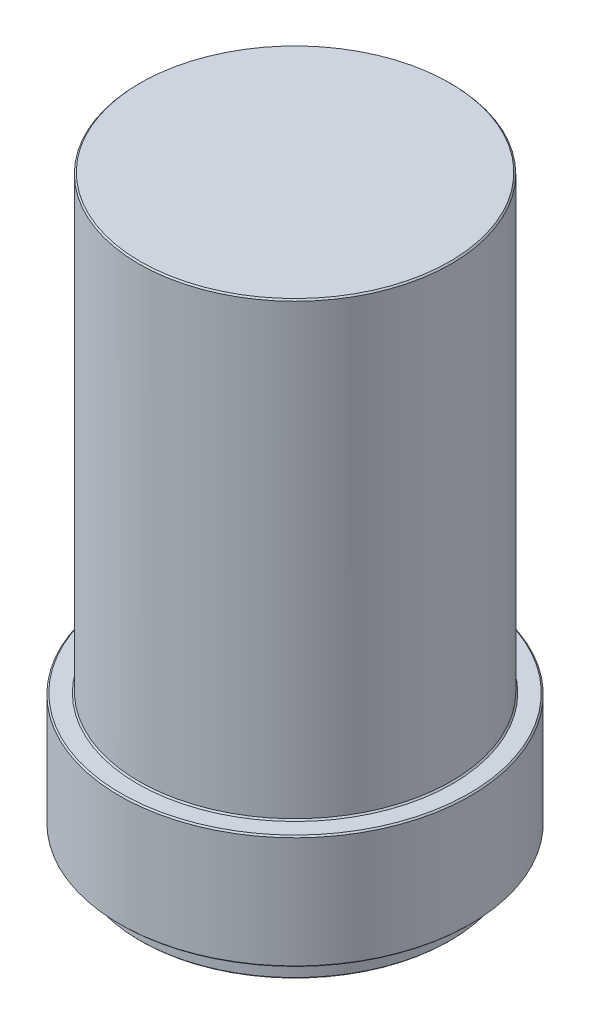
ISO-10303-21;
HEADER;
FILE_DESCRIPTION(('STEP AP214'),'2;1');
FILE_NAME('part.step','',(''),(''),'','','');
FILE_SCHEMA(('AUTOMOTIVE_DESIGN { 1 0 10303 214 1 1 1 1 }'));
ENDSEC;
DATA;
#1=APPLICATION_CONTEXT('core data for automotive mechanical design processes');
#2=APPLICATION_PROTOCOL_DEFINITION('international standard','automotive_design',2000,#1);
#3=PRODUCT_CONTEXT('',#1,'mechanical');
#4=PRODUCT('Part','Part','',(#3));
#5=PRODUCT_RELATED_PRODUCT_CATEGORY('part','',(#4));
#6=PRODUCT_DEFINITION_FORMATION('','',#4);
#7=PRODUCT_DEFINITION_CONTEXT('part definition',#1,'design');
#8=PRODUCT_DEFINITION('design','',#6,#7);
#9=PRODUCT_DEFINITION_SHAPE('','',#8);
#10=(LENGTH_UNIT() NAMED_UNIT(*) SI_UNIT(.MILLI.,.METRE.));
#11=(NAMED_UNIT(*) PLANE_ANGLE_UNIT() SI_UNIT($,.RADIAN.));
#12=(NAMED_UNIT(*) SI_UNIT($,.STERADIAN.) SOLID_ANGLE_UNIT());
#13=UNCERTAINTY_MEASURE_WITH_UNIT(LENGTH_MEASURE(1.E-05),#10,'distance_accuracy_value','');
#14=(GEOMETRIC_REPRESENTATION_CONTEXT(3) GLOBAL_UNCERTAINTY_ASSIGNED_CONTEXT((#13)) GLOBAL_UNIT_ASSIGNED_CONTEXT((#10,
#11,#12)) REPRESENTATION_CONTEXT('',''));
#15=CARTESIAN_POINT('',(0.,0.,0.));
#16=DIRECTION('',(0.,0.,1.));
#17=DIRECTION('',(1.,0.,0.));
#18=AXIS2_PLACEMENT_3D('',#15,#16,#17);
#19=CARTESIAN_POINT('',(0.,65.,0.));
#20=DIRECTION('',(0.,-1.,0.));
#21=DIRECTION('',(0.,0.,-1.));
#22=AXIS2_PLACEMENT_3D('',#19,#20,#21);
#23=CYLINDRICAL_SURFACE('',#22,22.5);
#24=CARTESIAN_POINT('',(0.,0.20000000000002,0.));
#25=DIRECTION('',(0.,-1.,0.));
#26=DIRECTION('',(0.,0.,-1.));
#27=AXIS2_PLACEMENT_3D('',#24,#25,#26);
#28=CIRCLE('',#27,22.5);
#29=CARTESIAN_POINT('',(0.,0.20000000000002,-22.5));
#30=VERTEX_POINT('',#29);
#31=EDGE_CURVE('E42',#30,#30,#28,.F.);
#32=ORIENTED_EDGE('',*,*,#31,.T.);
#33=EDGE_LOOP('',(#32));
#34=FACE_BOUND('',#33,.T.);
#35=CARTESIAN_POINT('',(0.,64.8,0.));
#36=DIRECTION('',(0.,1.,0.));
#37=DIRECTION('',(0.,0.,1.));
#38=AXIS2_PLACEMENT_3D('',#35,#36,#37);
#39=CIRCLE('',#38,22.5);
#40=CARTESIAN_POINT('',(0.,64.8,22.5));
#41=VERTEX_POINT('',#40);
#42=EDGE_CURVE('E46',#41,#41,#39,.F.);
#43=ORIENTED_EDGE('',*,*,#42,.T.);
#44=EDGE_LOOP('',(#43));
#45=FACE_BOUND('',#44,.T.);
#46=ADVANCED_FACE('F35',(#34,#45),#23,.T.);
#47=CARTESIAN_POINT('',(0.,65.,0.));
#48=DIRECTION('',(0.,1.,0.));
#49=DIRECTION('',(0.,0.,1.));
#50=AXIS2_PLACEMENT_3D('',#47,#48,#49);
#51=PLANE('',#50);
#52=CARTESIAN_POINT('',(0.,65.,0.));
#53=DIRECTION('',(0.,1.,0.));
#54=DIRECTION('',(0.,0.,1.));
#55=AXIS2_PLACEMENT_3D('',#52,#53,#54);
#56=CIRCLE('',#55,22.3);
#57=CARTESIAN_POINT('',(0.,65.,22.3));
#58=VERTEX_POINT('',#57);
#59=EDGE_CURVE('E10',#58,#58,#56,.T.);
#60=ORIENTED_EDGE('',*,*,#59,.T.);
#61=EDGE_LOOP('',(#60));
#62=FACE_BOUND('',#61,.T.);
#63=ADVANCED_FACE('F112',(#62),#51,.T.);
#64=CARTESIAN_POINT('',(0.,-16.4,0.));
#65=DIRECTION('',(0.,1.,0.));
#66=DIRECTION('',(0.,0.,1.));
#67=AXIS2_PLACEMENT_3D('',#64,#65,#66);
#68=CYLINDRICAL_SURFACE('',#67,25.3);
#69=CARTESIAN_POINT('',(0.,-16.2,0.));
#70=DIRECTION('',(0.,-1.,0.));
#71=DIRECTION('',(0.,0.,-1.));
#72=AXIS2_PLACEMENT_3D('',#69,#70,#71);
#73=CIRCLE('',#72,25.3);
#74=CARTESIAN_POINT('',(0.,-16.2,-25.3));
#75=VERTEX_POINT('',#74);
#76=EDGE_CURVE('E67',#75,#75,#73,.F.);
#77=ORIENTED_EDGE('',*,*,#76,.T.);
#78=EDGE_LOOP('',(#77));
#79=FACE_BOUND('',#78,.T.);
#80=CARTESIAN_POINT('',(0.,-0.200000000000027,0.));
#81=DIRECTION('',(0.,-1.,0.));
#82=DIRECTION('',(0.,0.,-1.));
#83=AXIS2_PLACEMENT_3D('',#80,#81,#82);
#84=CIRCLE('',#83,25.3);
#85=CARTESIAN_POINT('',(0.,-0.200000000000027,-25.3));
#86=VERTEX_POINT('',#85);
#87=EDGE_CURVE('E70',#86,#86,#84,.T.);
#88=ORIENTED_EDGE('',*,*,#87,.T.);
#89=EDGE_LOOP('',(#88));
#90=FACE_BOUND('',#89,.T.);
#91=ADVANCED_FACE('F117',(#79,#90),#68,.T.);
#92=CARTESIAN_POINT('',(0.,-16.4,0.));
#93=DIRECTION('',(0.,-1.,0.));
#94=DIRECTION('',(0.,0.,-1.));
#95=AXIS2_PLACEMENT_3D('',#92,#93,#94);
#96=PLANE('',#95);
#97=CARTESIAN_POINT('',(0.,-16.4,0.));
#98=DIRECTION('',(0.,-1.,0.));
#99=DIRECTION('',(0.,0.,-1.));
#100=AXIS2_PLACEMENT_3D('',#97,#98,#99);
#101=CIRCLE('',#100,25.1);
#102=CARTESIAN_POINT('',(0.,-16.4,-25.1));
#103=VERTEX_POINT('',#102);
#104=EDGE_CURVE('E73',#103,#103,#101,.T.);
#105=ORIENTED_EDGE('',*,*,#104,.T.);
#106=EDGE_LOOP('',(#105));
#107=FACE_BOUND('',#106,.T.);
#108=CARTESIAN_POINT('',(0.,-16.4,0.));
#109=DIRECTION('',(0.,-1.,0.));
#110=DIRECTION('',(0.,0.,-1.));
#111=AXIS2_PLACEMENT_3D('',#108,#109,#110);
#112=CIRCLE('',#111,22.6);
#113=CARTESIAN_POINT('',(0.,-16.4,22.6));
#114=VERTEX_POINT('',#113);
#115=EDGE_CURVE('E76',#114,#114,#112,.F.);
#116=ORIENTED_EDGE('',*,*,#115,.T.);
#117=EDGE_LOOP('',(#116));
#118=FACE_BOUND('',#117,.T.);
#119=ADVANCED_FACE('F80',(#107,#118),#96,.T.);
#120=CARTESIAN_POINT('',(0.,0.,0.));
#121=DIRECTION('',(0.,-1.,0.));
#122=DIRECTION('',(0.,0.,-1.));
#123=AXIS2_PLACEMENT_3D('',#120,#121,#122);
#124=PLANE('',#123);
#125=CARTESIAN_POINT('',(0.,0.,0.));
#126=DIRECTION('',(0.,-1.,0.));
#127=DIRECTION('',(0.,0.,-1.));
#128=AXIS2_PLACEMENT_3D('',#125,#126,#127);
#129=CIRCLE('',#128,25.1);
#130=CARTESIAN_POINT('',(0.,0.,-25.1));
#131=VERTEX_POINT('',#130);
#132=EDGE_CURVE('E50',#131,#131,#129,.F.);
#133=ORIENTED_EDGE('',*,*,#132,.T.);
#134=EDGE_LOOP('',(#133));
#135=FACE_BOUND('',#134,.T.);
#136=CARTESIAN_POINT('',(0.,0.,0.));
#137=DIRECTION('',(0.,-1.,0.));
#138=DIRECTION('',(0.,0.,-1.));
#139=AXIS2_PLACEMENT_3D('',#136,#137,#138);
#140=CIRCLE('',#139,22.7);
#141=CARTESIAN_POINT('',(0.,0.,-22.7));
#142=VERTEX_POINT('',#141);
#143=EDGE_CURVE('E55',#142,#142,#140,.T.);
#144=ORIENTED_EDGE('',*,*,#143,.T.);
#145=EDGE_LOOP('',(#144));
#146=FACE_BOUND('',#145,.T.);
#147=ADVANCED_FACE('F94',(#135,#146),#124,.F.);
#148=CARTESIAN_POINT('',(0.,-19.9,0.));
#149=DIRECTION('',(0.,1.,0.));
#150=DIRECTION('',(0.,0.,1.));
#151=AXIS2_PLACEMENT_3D('',#148,#149,#150);
#152=CYLINDRICAL_SURFACE('',#151,22.4);
#153=CARTESIAN_POINT('',(0.,-16.6,0.));
#154=DIRECTION('',(0.,-1.,0.));
#155=DIRECTION('',(0.,0.,-1.));
#156=AXIS2_PLACEMENT_3D('',#153,#154,#155);
#157=CIRCLE('',#156,22.4);
#158=CARTESIAN_POINT('',(0.,-16.6,22.4));
#159=VERTEX_POINT('',#158);
#160=EDGE_CURVE('E61',#159,#159,#157,.T.);
#161=ORIENTED_EDGE('',*,*,#160,.T.);
#162=EDGE_LOOP('',(#161));
#163=FACE_BOUND('',#162,.T.);
#164=CARTESIAN_POINT('',(0.,-19.7,0.));
#165=DIRECTION('',(0.,-1.,0.));
#166=DIRECTION('',(0.,0.,-1.));
#167=AXIS2_PLACEMENT_3D('',#164,#165,#166);
#168=CIRCLE('',#167,22.4);
#169=CARTESIAN_POINT('',(0.,-19.7,-22.4));
#170=VERTEX_POINT('',#169);
#171=EDGE_CURVE('E64',#170,#170,#168,.F.);
#172=ORIENTED_EDGE('',*,*,#171,.T.);
#173=EDGE_LOOP('',(#172));
#174=FACE_BOUND('',#173,.T.);
#175=ADVANCED_FACE('F90',(#163,#174),#152,.T.);
#176=CARTESIAN_POINT('',(0.,-19.9,0.));
#177=DIRECTION('',(0.,-1.,0.));
#178=DIRECTION('',(0.,0.,-1.));
#179=AXIS2_PLACEMENT_3D('',#176,#177,#178);
#180=PLANE('',#179);
#181=CARTESIAN_POINT('',(0.,-19.9,0.));
#182=DIRECTION('',(0.,-1.,0.));
#183=DIRECTION('',(0.,0.,-1.));
#184=AXIS2_PLACEMENT_3D('',#181,#182,#183);
#185=CIRCLE('',#184,22.2);
#186=CARTESIAN_POINT('',(0.,-19.9,-22.2));
#187=VERTEX_POINT('',#186);
#188=EDGE_CURVE('E58',#187,#187,#185,.T.);
#189=ORIENTED_EDGE('',*,*,#188,.T.);
#190=EDGE_LOOP('',(#189));
#191=FACE_BOUND('',#190,.T.);
#192=ADVANCED_FACE('F93',(#191),#180,.T.);
#193=CARTESIAN_POINT('',(0.,-16.4,0.));
#194=DIRECTION('',(0.,1.,0.));
#195=DIRECTION('',(0.,0.,1.));
#196=AXIS2_PLACEMENT_3D('',#193,#194,#195);
#197=CONICAL_SURFACE('',#196,25.1,0.785398163397422);
#198=ORIENTED_EDGE('',*,*,#76,.F.);
#199=EDGE_LOOP('',(#198));
#200=FACE_BOUND('',#199,.T.);
#201=ORIENTED_EDGE('',*,*,#104,.F.);
#202=EDGE_LOOP('',(#201));
#203=FACE_BOUND('',#202,.T.);
#204=ADVANCED_FACE('F86',(#200,#203),#197,.T.);
#205=CARTESIAN_POINT('',(0.,-16.6,0.));
#206=DIRECTION('',(0.,1.,0.));
#207=DIRECTION('',(0.,0.,1.));
#208=AXIS2_PLACEMENT_3D('',#205,#206,#207);
#209=CONICAL_SURFACE('',#208,22.4,0.785398163397466);
#210=CARTESIAN_POINT('',(0.,-16.4,22.6));
#211=CARTESIAN_POINT('',(0.,-16.4020833333333,22.5979166666667));
#212=CARTESIAN_POINT('',(0.,-16.4041666666667,22.5958333333333));
#213=CARTESIAN_POINT('',(0.,-16.4083333333333,22.5916666666667));
#214=CARTESIAN_POINT('',(0.,-16.4104166666667,22.5895833333333));
#215=CARTESIAN_POINT('',(0.,-16.4145833333333,22.5854166666667));
#216=CARTESIAN_POINT('',(0.,-16.4166666666667,22.5833333333333));
#217=CARTESIAN_POINT('',(0.,-16.4208333333333,22.5791666666667));
#218=CARTESIAN_POINT('',(0.,-16.4229166666667,22.5770833333333));
#219=CARTESIAN_POINT('',(0.,-16.4270833333333,22.5729166666667));
#220=CARTESIAN_POINT('',(0.,-16.4291666666667,22.5708333333333));
#221=CARTESIAN_POINT('',(0.,-16.4333333333333,22.5666666666667));
#222=CARTESIAN_POINT('',(0.,-16.4354166666667,22.5645833333333));
#223=CARTESIAN_POINT('',(0.,-16.4395833333333,22.5604166666667));
#224=CARTESIAN_POINT('',(0.,-16.4416666666667,22.5583333333333));
#225=CARTESIAN_POINT('',(0.,-16.4458333333333,22.5541666666667));
#226=CARTESIAN_POINT('',(0.,-16.4479166666667,22.5520833333333));
#227=CARTESIAN_POINT('',(0.,-16.4520833333333,22.5479166666667));
#228=CARTESIAN_POINT('',(0.,-16.4541666666667,22.5458333333333));
#229=CARTESIAN_POINT('',(0.,-16.4583333333333,22.5416666666667));
#230=CARTESIAN_POINT('',(0.,-16.4604166666667,22.5395833333333));
#231=CARTESIAN_POINT('',(0.,-16.4645833333333,22.5354166666667));
#232=CARTESIAN_POINT('',(0.,-16.4666666666667,22.5333333333333));
#233=CARTESIAN_POINT('',(0.,-16.4708333333333,22.5291666666667));
#234=CARTESIAN_POINT('',(0.,-16.4729166666667,22.5270833333333));
#235=CARTESIAN_POINT('',(0.,-16.4770833333333,22.5229166666667));
#236=CARTESIAN_POINT('',(0.,-16.4791666666667,22.5208333333333));
#237=CARTESIAN_POINT('',(0.,-16.4833333333333,22.5166666666667));
#238=CARTESIAN_POINT('',(0.,-16.4854166666667,22.5145833333333));
#239=CARTESIAN_POINT('',(0.,-16.4895833333333,22.5104166666667));
#240=CARTESIAN_POINT('',(0.,-16.4916666666667,22.5083333333333));
#241=CARTESIAN_POINT('',(0.,-16.4958333333333,22.5041666666667));
#242=CARTESIAN_POINT('',(0.,-16.4979166666667,22.5020833333333));
#243=CARTESIAN_POINT('',(0.,-16.5020833333333,22.4979166666667));
#244=CARTESIAN_POINT('',(0.,-16.5041666666667,22.4958333333333));
#245=CARTESIAN_POINT('',(0.,-16.5083333333333,22.4916666666667));
#246=CARTESIAN_POINT('',(0.,-16.5104166666667,22.4895833333333));
#247=CARTESIAN_POINT('',(0.,-16.5145833333333,22.4854166666667));
#248=CARTESIAN_POINT('',(0.,-16.5166666666667,22.4833333333333));
#249=CARTESIAN_POINT('',(0.,-16.5208333333333,22.4791666666667));
#250=CARTESIAN_POINT('',(0.,-16.5229166666667,22.4770833333333));
#251=CARTESIAN_POINT('',(0.,-16.5270833333333,22.4729166666667));
#252=CARTESIAN_POINT('',(0.,-16.5291666666667,22.4708333333333));
#253=CARTESIAN_POINT('',(0.,-16.5333333333333,22.4666666666667));
#254=CARTESIAN_POINT('',(0.,-16.5354166666667,22.4645833333333));
#255=CARTESIAN_POINT('',(0.,-16.5395833333333,22.4604166666667));
#256=CARTESIAN_POINT('',(0.,-16.5416666666667,22.4583333333333));
#257=CARTESIAN_POINT('',(0.,-16.5458333333333,22.4541666666667));
#258=CARTESIAN_POINT('',(0.,-16.5479166666667,22.4520833333333));
#259=CARTESIAN_POINT('',(0.,-16.5520833333333,22.4479166666667));
#260=CARTESIAN_POINT('',(0.,-16.5541666666667,22.4458333333333));
#261=CARTESIAN_POINT('',(0.,-16.5583333333333,22.4416666666667));
#262=CARTESIAN_POINT('',(0.,-16.5604166666667,22.4395833333333));
#263=CARTESIAN_POINT('',(0.,-16.5645833333333,22.4354166666667));
#264=CARTESIAN_POINT('',(0.,-16.5666666666667,22.4333333333333));
#265=CARTESIAN_POINT('',(0.,-16.5708333333333,22.4291666666667));
#266=CARTESIAN_POINT('',(0.,-16.5729166666667,22.4270833333333));
#267=CARTESIAN_POINT('',(0.,-16.5770833333333,22.4229166666667));
#268=CARTESIAN_POINT('',(0.,-16.5791666666667,22.4208333333333));
#269=CARTESIAN_POINT('',(0.,-16.5833333333333,22.4166666666667));
#270=CARTESIAN_POINT('',(0.,-16.5854166666666,22.4145833333333));
#271=CARTESIAN_POINT('',(0.,-16.5895833333333,22.4104166666667));
#272=CARTESIAN_POINT('',(0.,-16.5916666666667,22.4083333333333));
#273=CARTESIAN_POINT('',(0.,-16.5958333333333,22.4041666666667));
#274=CARTESIAN_POINT('',(0.,-16.5979166666667,22.4020833333333));
#275=CARTESIAN_POINT('',(0.,-16.6,22.4));
#276=B_SPLINE_CURVE_WITH_KNOTS('',3,(#210,#211,#212,#213,#214,#215,#216,#217,#218,#219,#220,
#221,#222,#223,#224,#225,#226,#227,#228,#229,#230,#231,#232,#233,#234,#235,#236,#237,#238,#239,
#240,#241,#242,#243,#244,#245,#246,#247,#248,#249,#250,#251,#252,#253,#254,#255,#256,#257,#258,
#259,#260,#261,#262,#263,#264,#265,#266,#267,#268,#269,#270,#271,#272,#273,#274,#275),
.UNSPECIFIED.,.F.,.F.,(4,2,2,2,2,2,2,2,2,2,2,2,2,2,2,2,2,2,2,2,2,2,2,2,2,2,2,2,2,2,2,2,4),(0.,
0.00883883476483578,0.0176776695296666,0.0265165042944975,0.0353553390593284,0.0441941738241593,
0.0530330085889901,0.0618718433538234,0.0707106781186543,0.0795495128834852,0.088388347648316,
0.0972271824131494,0.10606601717798,0.114904851942814,0.123743686707644,0.132582521472475,
0.141421356237306,0.150260191002137,0.159099025766968,0.167937860531799,0.176776695296632,
0.185615530061463,0.194454364826296,0.203293199591127,0.212132034355958,0.220970869120789,
0.229809703885622,0.238648538650453,0.247487373415284,0.256326208180115,0.265165042944946,
0.274003877709777,0.28284271247461),.UNSPECIFIED.);
#277=EDGE_CURVE('BSEAM82',#114,#159,#276,.T.);
#278=ORIENTED_EDGE('',*,*,#115,.F.);
#279=ORIENTED_EDGE('',*,*,#160,.F.);
#280=ORIENTED_EDGE('',*,*,#277,.T.);
#281=ORIENTED_EDGE('',*,*,#277,.F.);
#282=EDGE_LOOP('',(#278,#280,#279,#281));
#283=FACE_BOUND('',#282,.T.);
#284=ADVANCED_FACE('F82',(#283),#209,.T.);
#285=CARTESIAN_POINT('',(0.,-19.9,0.));
#286=DIRECTION('',(0.,1.,0.));
#287=DIRECTION('',(0.,0.,1.));
#288=AXIS2_PLACEMENT_3D('',#285,#286,#287);
#289=CONICAL_SURFACE('',#288,22.2,0.785398163397474);
#290=ORIENTED_EDGE('',*,*,#171,.F.);
#291=EDGE_LOOP('',(#290));
#292=FACE_BOUND('',#291,.T.);
#293=ORIENTED_EDGE('',*,*,#188,.F.);
#294=EDGE_LOOP('',(#293));
#295=FACE_BOUND('',#294,.T.);
#296=ADVANCED_FACE('F85',(#292,#295),#289,.T.);
#297=CARTESIAN_POINT('',(0.,-0.200000000000027,0.));
#298=DIRECTION('',(0.,-1.,0.));
#299=DIRECTION('',(0.,0.,-1.));
#300=AXIS2_PLACEMENT_3D('',#297,#298,#299);
#301=CONICAL_SURFACE('',#300,25.3,0.78539816339744);
#302=CARTESIAN_POINT('',(0.,0.,-25.1));
#303=CARTESIAN_POINT('',(0.,-0.00208333333333453,-25.1020833333333));
#304=CARTESIAN_POINT('',(0.,-0.00416666666666781,-25.1041666666666));
#305=CARTESIAN_POINT('',(0.,-0.00833333333333437,-25.1083333333333));
#306=CARTESIAN_POINT('',(0.,-0.0104166666666677,-25.1104166666666));
#307=CARTESIAN_POINT('',(0.,-0.014583333333335,-25.1145833333333));
#308=CARTESIAN_POINT('',(0.,-0.0166666666666691,-25.1166666666666));
#309=CARTESIAN_POINT('',(0.,-0.0208333333333364,-25.1208333333333));
#310=CARTESIAN_POINT('',(0.,-0.0229166666666695,-25.1229166666666));
#311=CARTESIAN_POINT('',(0.,-0.0270833333333365,-25.1270833333333));
#312=CARTESIAN_POINT('',(0.,-0.0291666666666703,-25.1291666666666));
#313=CARTESIAN_POINT('',(0.,-0.0333333333333379,-25.1333333333333));
#314=CARTESIAN_POINT('',(0.,-0.0354166666666718,-25.1354166666666));
#315=CARTESIAN_POINT('',(0.,-0.0395833333333387,-25.1395833333333));
#316=CARTESIAN_POINT('',(0.,-0.0416666666666719,-25.1416666666666));
#317=CARTESIAN_POINT('',(0.,-0.0458333333333391,-25.1458333333333));
#318=CARTESIAN_POINT('',(0.,-0.0479166666666733,-25.1479166666666));
#319=CARTESIAN_POINT('',(0.,-0.0520833333333405,-25.1520833333333));
#320=CARTESIAN_POINT('',(0.,-0.0541666666666737,-25.1541666666667));
#321=CARTESIAN_POINT('',(0.,-0.0583333333333406,-25.1583333333333));
#322=CARTESIAN_POINT('',(0.,-0.0604166666666744,-25.1604166666666));
#323=CARTESIAN_POINT('',(0.,-0.0645833333333421,-25.1645833333333));
#324=CARTESIAN_POINT('',(0.,-0.0666666666666759,-25.1666666666667));
#325=CARTESIAN_POINT('',(0.,-0.0708333333333429,-25.1708333333333));
#326=CARTESIAN_POINT('',(0.,-0.072916666666676,-25.1729166666667));
#327=CARTESIAN_POINT('',(0.,-0.0770833333333433,-25.1770833333333));
#328=CARTESIAN_POINT('',(0.,-0.0791666666666774,-25.1791666666667));
#329=CARTESIAN_POINT('',(0.,-0.0833333333333447,-25.1833333333333));
#330=CARTESIAN_POINT('',(0.,-0.0854166666666778,-25.1854166666667));
#331=CARTESIAN_POINT('',(0.,-0.0895833333333448,-25.1895833333333));
#332=CARTESIAN_POINT('',(0.,-0.0916666666666786,-25.1916666666667));
#333=CARTESIAN_POINT('',(0.,-0.0958333333333462,-25.1958333333333));
#334=CARTESIAN_POINT('',(0.,-0.0979166666666801,-25.1979166666667));
#335=CARTESIAN_POINT('',(0.,-0.102083333333347,-25.2020833333333));
#336=CARTESIAN_POINT('',(0.,-0.10416666666668,-25.2041666666667));
#337=CARTESIAN_POINT('',(0.,-0.108333333333347,-25.2083333333333));
#338=CARTESIAN_POINT('',(0.,-0.110416666666682,-25.2104166666667));
#339=CARTESIAN_POINT('',(0.,-0.114583333333349,-25.2145833333333));
#340=CARTESIAN_POINT('',(0.,-0.116666666666682,-25.2166666666667));
#341=CARTESIAN_POINT('',(0.,-0.120833333333349,-25.2208333333333));
#342=CARTESIAN_POINT('',(0.,-0.122916666666683,-25.2229166666667));
#343=CARTESIAN_POINT('',(0.,-0.127083333333351,-25.2270833333333));
#344=CARTESIAN_POINT('',(0.,-0.129166666666684,-25.2291666666667));
#345=CARTESIAN_POINT('',(0.,-0.133333333333351,-25.2333333333333));
#346=CARTESIAN_POINT('',(0.,-0.135416666666684,-25.2354166666667));
#347=CARTESIAN_POINT('',(0.,-0.139583333333352,-25.2395833333333));
#348=CARTESIAN_POINT('',(0.,-0.141666666666686,-25.2416666666667));
#349=CARTESIAN_POINT('',(0.,-0.145833333333353,-25.2458333333333));
#350=CARTESIAN_POINT('',(0.,-0.147916666666686,-25.2479166666667));
#351=CARTESIAN_POINT('',(0.,-0.152083333333353,-25.2520833333333));
#352=CARTESIAN_POINT('',(0.,-0.154166666666687,-25.2541666666667));
#353=CARTESIAN_POINT('',(0.,-0.158333333333355,-25.2583333333333));
#354=CARTESIAN_POINT('',(0.,-0.160416666666688,-25.2604166666667));
#355=CARTESIAN_POINT('',(0.,-0.164583333333355,-25.2645833333333));
#356=CARTESIAN_POINT('',(0.,-0.166666666666689,-25.2666666666667));
#357=CARTESIAN_POINT('',(0.,-0.170833333333356,-25.2708333333333));
#358=CARTESIAN_POINT('',(0.,-0.17291666666669,-25.2729166666667));
#359=CARTESIAN_POINT('',(0.,-0.177083333333357,-25.2770833333333));
#360=CARTESIAN_POINT('',(0.,-0.17916666666669,-25.2791666666667));
#361=CARTESIAN_POINT('',(0.,-0.183333333333357,-25.2833333333333));
#362=CARTESIAN_POINT('',(0.,-0.185416666666691,-25.2854166666667));
#363=CARTESIAN_POINT('',(0.,-0.189583333333359,-25.2895833333333));
#364=CARTESIAN_POINT('',(0.,-0.191666666666692,-25.2916666666667));
#365=CARTESIAN_POINT('',(0.,-0.195833333333359,-25.2958333333333));
#366=CARTESIAN_POINT('',(0.,-0.197916666666692,-25.2979166666667));
#367=CARTESIAN_POINT('',(0.,-0.200000000000027,-25.3));
#368=B_SPLINE_CURVE_WITH_KNOTS('',3,(#302,#303,#304,#305,#306,#307,#308,#309,#310,#311,#312,
#313,#314,#315,#316,#317,#318,#319,#320,#321,#322,#323,#324,#325,#326,#327,#328,#329,#330,#331,
#332,#333,#334,#335,#336,#337,#338,#339,#340,#341,#342,#343,#344,#345,#346,#347,#348,#349,#350,
#351,#352,#353,#354,#355,#356,#357,#358,#359,#360,#361,#362,#363,#364,#365,#366,#367),
.UNSPECIFIED.,.F.,.F.,(4,2,2,2,2,2,2,2,2,2,2,2,2,2,2,2,2,2,2,2,2,2,2,2,2,2,2,2,2,2,2,2,4),(0.,
0.00883883476483194,0.0176776695296663,0.0265165042944983,0.0353553390593327,0.0441941738241646,
0.0530330085889966,0.061871843353831,0.0707106781186629,0.0795495128834973,0.0883883476483292,
0.0972271824131612,0.106066017177996,0.114904851942828,0.123743686707662,0.132582521472494,
0.141421356237326,0.15026019100216,0.159099025766992,0.167937860531827,0.176776695296659,
0.185615530061493,0.194454364826325,0.203293199591157,0.212132034355991,0.220970869120823,
0.229809703885657,0.238648538650489,0.247487373415321,0.256326208180156,0.265165042944988,
0.274003877709822,0.282842712474654),.UNSPECIFIED.);
#369=EDGE_CURVE('BSEAM100',#131,#86,#368,.T.);
#370=ORIENTED_EDGE('',*,*,#132,.F.);
#371=ORIENTED_EDGE('',*,*,#87,.F.);
#372=ORIENTED_EDGE('',*,*,#369,.T.);
#373=ORIENTED_EDGE('',*,*,#369,.F.);
#374=EDGE_LOOP('',(#370,#372,#371,#373));
#375=FACE_BOUND('',#374,.T.);
#376=ADVANCED_FACE('F100',(#375),#301,.T.);
#377=CARTESIAN_POINT('',(0.,0.20000000000002,0.));
#378=DIRECTION('',(0.,-1.,0.));
#379=DIRECTION('',(0.,0.,-1.));
#380=AXIS2_PLACEMENT_3D('',#377,#378,#379);
#381=CONICAL_SURFACE('',#380,22.5,0.785398163397474);
#382=ORIENTED_EDGE('',*,*,#143,.F.);
#383=EDGE_LOOP('',(#382));
#384=FACE_BOUND('',#383,.T.);
#385=ORIENTED_EDGE('',*,*,#31,.F.);
#386=EDGE_LOOP('',(#385));
#387=FACE_BOUND('',#386,.T.);
#388=ADVANCED_FACE('F123',(#384,#387),#381,.T.);
#389=CARTESIAN_POINT('',(0.,65.,0.));
#390=DIRECTION('',(0.,-1.,0.));
#391=DIRECTION('',(0.,0.,-1.));
#392=AXIS2_PLACEMENT_3D('',#389,#390,#391);
#393=CONICAL_SURFACE('',#392,22.3,0.785398163397457);
#394=ORIENTED_EDGE('',*,*,#42,.F.);
#395=EDGE_LOOP('',(#394));
#396=FACE_BOUND('',#395,.T.);
#397=ORIENTED_EDGE('',*,*,#59,.F.);
#398=EDGE_LOOP('',(#397));
#399=FACE_BOUND('',#398,.T.);
#400=ADVANCED_FACE('F37',(#396,#399),#393,.T.);
#401=CLOSED_SHELL('',(#46,#63,#91,#119,#147,#175,#192,#204,#284,#296,#376,#388,#400));
#402=MANIFOLD_SOLID_BREP('B2',#401);
#403=ADVANCED_BREP_SHAPE_REPRESENTATION('',(#18,#402),#14);
#404=SHAPE_DEFINITION_REPRESENTATION(#9,#403);
ENDSEC;
END-ISO-10303-21;
